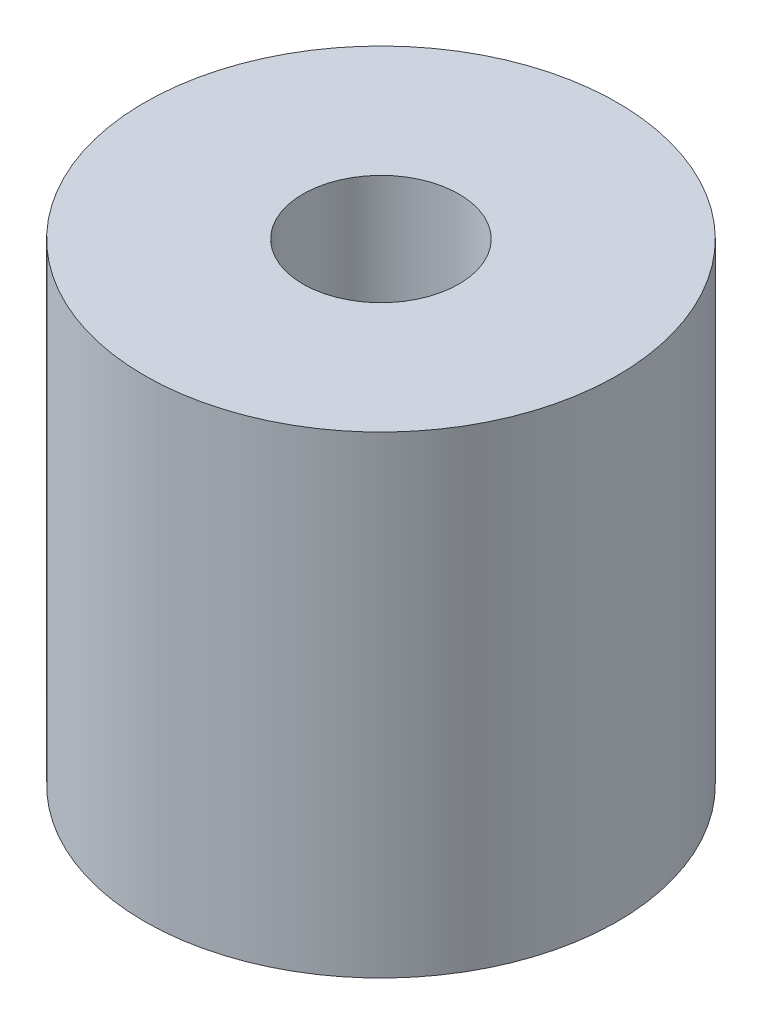
ISO-10303-21;
HEADER;
FILE_DESCRIPTION(('STEP AP214'),'2;1');
FILE_NAME('part.step','',(''),(''),'','','');
FILE_SCHEMA(('AUTOMOTIVE_DESIGN { 1 0 10303 214 1 1 1 1 }'));
ENDSEC;
DATA;
#1=APPLICATION_CONTEXT('core data for automotive mechanical design processes');
#2=APPLICATION_PROTOCOL_DEFINITION('international standard','automotive_design',2000,#1);
#3=PRODUCT_CONTEXT('',#1,'mechanical');
#4=PRODUCT('Part','Part','',(#3));
#5=PRODUCT_RELATED_PRODUCT_CATEGORY('part','',(#4));
#6=PRODUCT_DEFINITION_FORMATION('','',#4);
#7=PRODUCT_DEFINITION_CONTEXT('part definition',#1,'design');
#8=PRODUCT_DEFINITION('design','',#6,#7);
#9=PRODUCT_DEFINITION_SHAPE('','',#8);
#10=(LENGTH_UNIT() NAMED_UNIT(*) SI_UNIT(.MILLI.,.METRE.));
#11=(NAMED_UNIT(*) PLANE_ANGLE_UNIT() SI_UNIT($,.RADIAN.));
#12=(NAMED_UNIT(*) SI_UNIT($,.STERADIAN.) SOLID_ANGLE_UNIT());
#13=UNCERTAINTY_MEASURE_WITH_UNIT(LENGTH_MEASURE(1.E-05),#10,'distance_accuracy_value','');
#14=(GEOMETRIC_REPRESENTATION_CONTEXT(3) GLOBAL_UNCERTAINTY_ASSIGNED_CONTEXT((#13)) GLOBAL_UNIT_ASSIGNED_CONTEXT((#10,
#11,#12)) REPRESENTATION_CONTEXT('',''));
#15=CARTESIAN_POINT('',(0.,0.,0.));
#16=DIRECTION('',(0.,0.,1.));
#17=DIRECTION('',(1.,0.,0.));
#18=AXIS2_PLACEMENT_3D('',#15,#16,#17);
#19=CARTESIAN_POINT('',(0.,10.,0.));
#20=DIRECTION('',(0.,1.,0.));
#21=DIRECTION('',(0.,0.,1.));
#22=AXIS2_PLACEMENT_3D('',#19,#20,#21);
#23=PLANE('',#22);
#24=CARTESIAN_POINT('',(0.,10.,0.));
#25=DIRECTION('',(0.,1.,0.));
#26=DIRECTION('',(0.,0.,1.));
#27=AXIS2_PLACEMENT_3D('',#24,#25,#26);
#28=CIRCLE('',#27,5.);
#29=CARTESIAN_POINT('',(0.,10.,5.));
#30=VERTEX_POINT('',#29);
#31=EDGE_CURVE('E10',#30,#30,#28,.T.);
#32=ORIENTED_EDGE('',*,*,#31,.T.);
#33=EDGE_LOOP('',(#32));
#34=FACE_BOUND('',#33,.T.);
#35=CARTESIAN_POINT('',(0.,10.,0.));
#36=DIRECTION('',(0.,1.,0.));
#37=DIRECTION('',(0.,0.,1.));
#38=AXIS2_PLACEMENT_3D('',#35,#36,#37);
#39=CIRCLE('',#38,1.65);
#40=CARTESIAN_POINT('',(0.,10.,1.65));
#41=VERTEX_POINT('',#40);
#42=EDGE_CURVE('E44',#41,#41,#39,.T.);
#43=ORIENTED_EDGE('',*,*,#42,.F.);
#44=EDGE_LOOP('',(#43));
#45=FACE_BOUND('',#44,.T.);
#46=ADVANCED_FACE('F33',(#34,#45),#23,.T.);
#47=CARTESIAN_POINT('',(0.,0.,0.));
#48=DIRECTION('',(0.,1.,0.));
#49=DIRECTION('',(0.,0.,1.));
#50=AXIS2_PLACEMENT_3D('',#47,#48,#49);
#51=PLANE('',#50);
#52=CARTESIAN_POINT('',(0.,0.,0.));
#53=DIRECTION('',(0.,1.,0.));
#54=DIRECTION('',(0.,0.,1.));
#55=AXIS2_PLACEMENT_3D('',#52,#53,#54);
#56=CIRCLE('',#55,5.);
#57=CARTESIAN_POINT('',(0.,0.,5.));
#58=VERTEX_POINT('',#57);
#59=EDGE_CURVE('E37',#58,#58,#56,.T.);
#60=ORIENTED_EDGE('',*,*,#59,.F.);
#61=EDGE_LOOP('',(#60));
#62=FACE_BOUND('',#61,.T.);
#63=CARTESIAN_POINT('',(0.,0.,0.));
#64=DIRECTION('',(0.,1.,0.));
#65=DIRECTION('',(0.,0.,1.));
#66=AXIS2_PLACEMENT_3D('',#63,#64,#65);
#67=CIRCLE('',#66,1.65);
#68=CARTESIAN_POINT('',(0.,0.,1.65));
#69=VERTEX_POINT('',#68);
#70=EDGE_CURVE('E46',#69,#69,#67,.T.);
#71=ORIENTED_EDGE('',*,*,#70,.T.);
#72=EDGE_LOOP('',(#71));
#73=FACE_BOUND('',#72,.T.);
#74=ADVANCED_FACE('F56',(#62,#73),#51,.F.);
#75=CARTESIAN_POINT('',(0.,10.,0.));
#76=DIRECTION('',(0.,-1.,0.));
#77=DIRECTION('',(0.,0.,-1.));
#78=AXIS2_PLACEMENT_3D('',#75,#76,#77);
#79=CYLINDRICAL_SURFACE('',#78,5.);
#80=ORIENTED_EDGE('',*,*,#31,.F.);
#81=EDGE_LOOP('',(#80));
#82=FACE_BOUND('',#81,.T.);
#83=ORIENTED_EDGE('',*,*,#59,.T.);
#84=EDGE_LOOP('',(#83));
#85=FACE_BOUND('',#84,.T.);
#86=ADVANCED_FACE('F35',(#82,#85),#79,.T.);
#87=CARTESIAN_POINT('',(0.,10.,0.));
#88=DIRECTION('',(0.,-1.,0.));
#89=DIRECTION('',(0.,0.,-1.));
#90=AXIS2_PLACEMENT_3D('',#87,#88,#89);
#91=CYLINDRICAL_SURFACE('',#90,1.65);
#92=ORIENTED_EDGE('',*,*,#42,.T.);
#93=EDGE_LOOP('',(#92));
#94=FACE_BOUND('',#93,.T.);
#95=ORIENTED_EDGE('',*,*,#70,.F.);
#96=EDGE_LOOP('',(#95));
#97=FACE_BOUND('',#96,.T.);
#98=ADVANCED_FACE('F52',(#94,#97),#91,.F.);
#99=CLOSED_SHELL('',(#46,#74,#86,#98));
#100=MANIFOLD_SOLID_BREP('B2',#99);
#101=ADVANCED_BREP_SHAPE_REPRESENTATION('',(#18,#100),#14);
#102=SHAPE_DEFINITION_REPRESENTATION(#9,#101);
ENDSEC;
END-ISO-10303-21;
